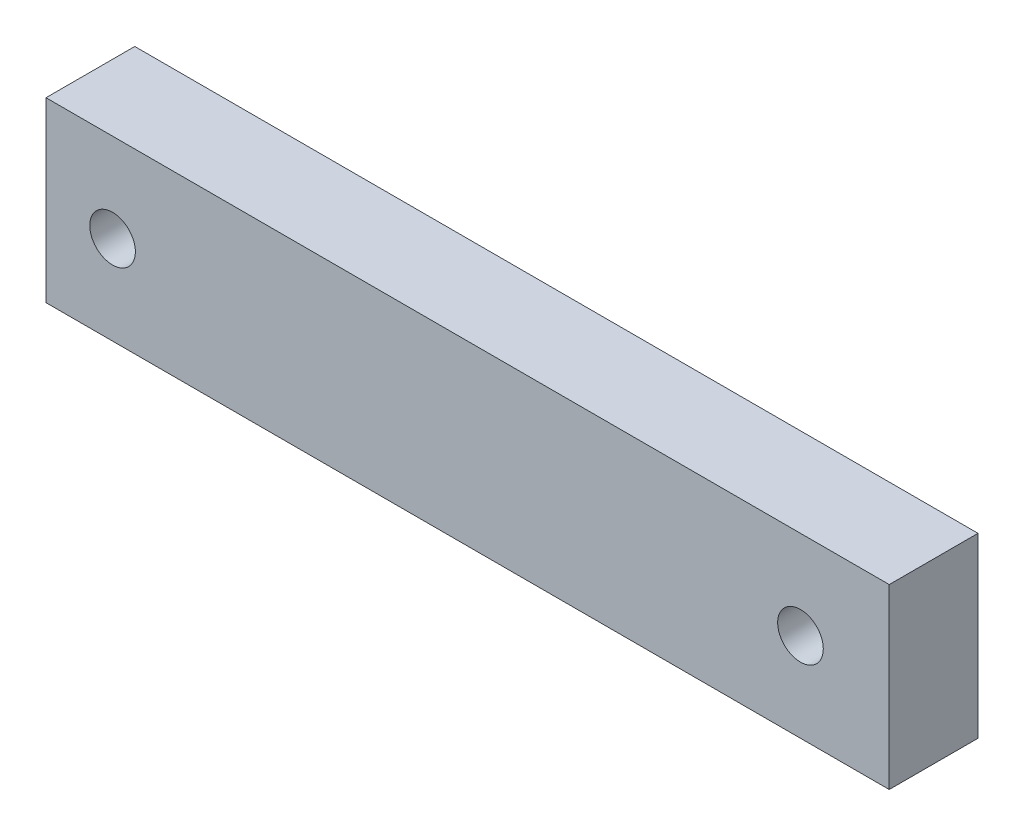
ISO-10303-21;
HEADER;
FILE_DESCRIPTION(('STEP AP214'),'2;1');
FILE_NAME('part.step','',(''),(''),'','','');
FILE_SCHEMA(('AUTOMOTIVE_DESIGN { 1 0 10303 214 1 1 1 1 }'));
ENDSEC;
DATA;
#1=APPLICATION_CONTEXT('core data for automotive mechanical design processes');
#2=APPLICATION_PROTOCOL_DEFINITION('international standard','automotive_design',2000,#1);
#3=PRODUCT_CONTEXT('',#1,'mechanical');
#4=PRODUCT('Part','Part','',(#3));
#5=PRODUCT_RELATED_PRODUCT_CATEGORY('part','',(#4));
#6=PRODUCT_DEFINITION_FORMATION('','',#4);
#7=PRODUCT_DEFINITION_CONTEXT('part definition',#1,'design');
#8=PRODUCT_DEFINITION('design','',#6,#7);
#9=PRODUCT_DEFINITION_SHAPE('','',#8);
#10=(LENGTH_UNIT() NAMED_UNIT(*) SI_UNIT(.MILLI.,.METRE.));
#11=(NAMED_UNIT(*) PLANE_ANGLE_UNIT() SI_UNIT($,.RADIAN.));
#12=(NAMED_UNIT(*) SI_UNIT($,.STERADIAN.) SOLID_ANGLE_UNIT());
#13=UNCERTAINTY_MEASURE_WITH_UNIT(LENGTH_MEASURE(1.E-05),#10,'distance_accuracy_value','');
#14=(GEOMETRIC_REPRESENTATION_CONTEXT(3) GLOBAL_UNCERTAINTY_ASSIGNED_CONTEXT((#13)) GLOBAL_UNIT_ASSIGNED_CONTEXT((#10,
#11,#12)) REPRESENTATION_CONTEXT('',''));
#15=CARTESIAN_POINT('',(0.,0.,0.));
#16=DIRECTION('',(0.,0.,1.));
#17=DIRECTION('',(1.,0.,0.));
#18=AXIS2_PLACEMENT_3D('',#15,#16,#17);
#19=CARTESIAN_POINT('',(30.1625,-6.35,6.35));
#20=DIRECTION('',(-1.,0.,0.));
#21=DIRECTION('',(0.,0.,1.));
#22=AXIS2_PLACEMENT_3D('',#19,#20,#21);
#23=PLANE('',#22);
#24=DIRECTION('',(0.,1.,0.));
#25=VECTOR('',#24,1.);
#26=CARTESIAN_POINT('',(30.1625,-6.35,0.));
#27=LINE('',#26,#25);
#28=CARTESIAN_POINT('',(30.1625,-6.35,0.));
#29=VERTEX_POINT('',#28);
#30=CARTESIAN_POINT('',(30.1625,6.35,0.));
#31=VERTEX_POINT('',#30);
#32=EDGE_CURVE('E97',#29,#31,#27,.T.);
#33=ORIENTED_EDGE('',*,*,#32,.T.);
#34=DIRECTION('',(0.,0.,-1.));
#35=VECTOR('',#34,1.);
#36=CARTESIAN_POINT('',(30.1625,6.35,6.35));
#37=LINE('',#36,#35);
#38=CARTESIAN_POINT('',(30.1625,6.35,6.35));
#39=VERTEX_POINT('',#38);
#40=EDGE_CURVE('E11',#39,#31,#37,.T.);
#41=ORIENTED_EDGE('',*,*,#40,.F.);
#42=DIRECTION('',(0.,1.,0.));
#43=VECTOR('',#42,1.);
#44=CARTESIAN_POINT('',(30.1625,-6.35,6.35));
#45=LINE('',#44,#43);
#46=CARTESIAN_POINT('',(30.1625,-6.35,6.35));
#47=VERTEX_POINT('',#46);
#48=EDGE_CURVE('E84',#47,#39,#45,.T.);
#49=ORIENTED_EDGE('',*,*,#48,.F.);
#50=DIRECTION('',(0.,0.,-1.));
#51=VECTOR('',#50,1.);
#52=CARTESIAN_POINT('',(30.1625,-6.35,6.35));
#53=LINE('',#52,#51);
#54=EDGE_CURVE('E93',#47,#29,#53,.T.);
#55=ORIENTED_EDGE('',*,*,#54,.T.);
#56=EDGE_LOOP('',(#33,#41,#49,#55));
#57=FACE_BOUND('',#56,.T.);
#58=ADVANCED_FACE('F32',(#57),#23,.F.);
#59=CARTESIAN_POINT('',(-30.1625,6.35,6.35));
#60=DIRECTION('',(0.,-1.,0.));
#61=DIRECTION('',(0.,0.,-1.));
#62=AXIS2_PLACEMENT_3D('',#59,#60,#61);
#63=PLANE('',#62);
#64=DIRECTION('',(-1.,0.,0.));
#65=VECTOR('',#64,1.);
#66=CARTESIAN_POINT('',(-30.1625,6.35,0.));
#67=LINE('',#66,#65);
#68=CARTESIAN_POINT('',(-30.1625,6.35,0.));
#69=VERTEX_POINT('',#68);
#70=EDGE_CURVE('E88',#31,#69,#67,.T.);
#71=ORIENTED_EDGE('',*,*,#70,.T.);
#72=DIRECTION('',(0.,0.,-1.));
#73=VECTOR('',#72,1.);
#74=CARTESIAN_POINT('',(-30.1625,6.35,6.35));
#75=LINE('',#74,#73);
#76=CARTESIAN_POINT('',(-30.1625,6.35,6.35));
#77=VERTEX_POINT('',#76);
#78=EDGE_CURVE('E41',#77,#69,#75,.T.);
#79=ORIENTED_EDGE('',*,*,#78,.F.);
#80=DIRECTION('',(-1.,0.,0.));
#81=VECTOR('',#80,1.);
#82=CARTESIAN_POINT('',(-30.1625,6.35,6.35));
#83=LINE('',#82,#81);
#84=EDGE_CURVE('E79',#39,#77,#83,.T.);
#85=ORIENTED_EDGE('',*,*,#84,.F.);
#86=ORIENTED_EDGE('',*,*,#40,.T.);
#87=EDGE_LOOP('',(#71,#79,#85,#86));
#88=FACE_BOUND('',#87,.T.);
#89=ADVANCED_FACE('F87',(#88),#63,.F.);
#90=CARTESIAN_POINT('',(-30.1625,-6.35,6.35));
#91=DIRECTION('',(1.,0.,0.));
#92=DIRECTION('',(0.,0.,-1.));
#93=AXIS2_PLACEMENT_3D('',#90,#91,#92);
#94=PLANE('',#93);
#95=DIRECTION('',(0.,-1.,0.));
#96=VECTOR('',#95,1.);
#97=CARTESIAN_POINT('',(-30.1625,-6.35,0.));
#98=LINE('',#97,#96);
#99=CARTESIAN_POINT('',(-30.1625,-6.35,0.));
#100=VERTEX_POINT('',#99);
#101=EDGE_CURVE('E66',#69,#100,#98,.T.);
#102=ORIENTED_EDGE('',*,*,#101,.T.);
#103=DIRECTION('',(0.,0.,-1.));
#104=VECTOR('',#103,1.);
#105=CARTESIAN_POINT('',(-30.1625,-6.35,6.35));
#106=LINE('',#105,#104);
#107=CARTESIAN_POINT('',(-30.1625,-6.35,6.35));
#108=VERTEX_POINT('',#107);
#109=EDGE_CURVE('E89',#108,#100,#106,.T.);
#110=ORIENTED_EDGE('',*,*,#109,.F.);
#111=DIRECTION('',(0.,-1.,0.));
#112=VECTOR('',#111,1.);
#113=CARTESIAN_POINT('',(-30.1625,-6.35,6.35));
#114=LINE('',#113,#112);
#115=EDGE_CURVE('E82',#77,#108,#114,.T.);
#116=ORIENTED_EDGE('',*,*,#115,.F.);
#117=ORIENTED_EDGE('',*,*,#78,.T.);
#118=EDGE_LOOP('',(#102,#110,#116,#117));
#119=FACE_BOUND('',#118,.T.);
#120=ADVANCED_FACE('F91',(#119),#94,.F.);
#121=CARTESIAN_POINT('',(-30.1625,-6.35,6.35));
#122=DIRECTION('',(0.,1.,0.));
#123=DIRECTION('',(0.,0.,1.));
#124=AXIS2_PLACEMENT_3D('',#121,#122,#123);
#125=PLANE('',#124);
#126=DIRECTION('',(1.,0.,0.));
#127=VECTOR('',#126,1.);
#128=CARTESIAN_POINT('',(-30.1625,-6.35,0.));
#129=LINE('',#128,#127);
#130=EDGE_CURVE('E72',#100,#29,#129,.T.);
#131=ORIENTED_EDGE('',*,*,#130,.T.);
#132=ORIENTED_EDGE('',*,*,#54,.F.);
#133=DIRECTION('',(1.,0.,0.));
#134=VECTOR('',#133,1.);
#135=CARTESIAN_POINT('',(-30.1625,-6.35,6.35));
#136=LINE('',#135,#134);
#137=EDGE_CURVE('E49',#108,#47,#136,.T.);
#138=ORIENTED_EDGE('',*,*,#137,.F.);
#139=ORIENTED_EDGE('',*,*,#109,.T.);
#140=EDGE_LOOP('',(#131,#132,#138,#139));
#141=FACE_BOUND('',#140,.T.);
#142=ADVANCED_FACE('F105',(#141),#125,.F.);
#143=CARTESIAN_POINT('',(30.1625,6.35,6.35));
#144=DIRECTION('',(0.,0.,-1.));
#145=DIRECTION('',(-1.,0.,0.));
#146=AXIS2_PLACEMENT_3D('',#143,#144,#145);
#147=PLANE('',#146);
#148=CARTESIAN_POINT('',(-25.4,0.,6.35));
#149=DIRECTION('',(0.,0.,1.));
#150=DIRECTION('',(1.,0.,0.));
#151=AXIS2_PLACEMENT_3D('',#148,#149,#150);
#152=CIRCLE('',#151,1.63194999999999);
#153=CARTESIAN_POINT('',(-23.76805,0.,6.35));
#154=VERTEX_POINT('',#153);
#155=EDGE_CURVE('E116',#154,#154,#152,.T.);
#156=ORIENTED_EDGE('',*,*,#155,.F.);
#157=EDGE_LOOP('',(#156));
#158=FACE_BOUND('',#157,.T.);
#159=CARTESIAN_POINT('',(23.8125,0.,6.35));
#160=DIRECTION('',(0.,0.,1.));
#161=DIRECTION('',(1.,0.,0.));
#162=AXIS2_PLACEMENT_3D('',#159,#160,#161);
#163=CIRCLE('',#162,1.63194999999999);
#164=CARTESIAN_POINT('',(25.44445,0.,6.35));
#165=VERTEX_POINT('',#164);
#166=EDGE_CURVE('E113',#165,#165,#163,.T.);
#167=ORIENTED_EDGE('',*,*,#166,.F.);
#168=EDGE_LOOP('',(#167));
#169=FACE_BOUND('',#168,.T.);
#170=ORIENTED_EDGE('',*,*,#48,.T.);
#171=ORIENTED_EDGE('',*,*,#84,.T.);
#172=ORIENTED_EDGE('',*,*,#115,.T.);
#173=ORIENTED_EDGE('',*,*,#137,.T.);
#174=EDGE_LOOP('',(#170,#171,#172,#173));
#175=FACE_BOUND('',#174,.T.);
#176=ADVANCED_FACE('F80',(#158,#169,#175),#147,.F.);
#177=CARTESIAN_POINT('',(30.1625,6.35,0.));
#178=DIRECTION('',(0.,0.,-1.));
#179=DIRECTION('',(-1.,0.,0.));
#180=AXIS2_PLACEMENT_3D('',#177,#178,#179);
#181=PLANE('',#180);
#182=CARTESIAN_POINT('',(-25.4,0.,0.));
#183=DIRECTION('',(0.,0.,-1.));
#184=DIRECTION('',(-1.,0.,0.));
#185=AXIS2_PLACEMENT_3D('',#182,#183,#184);
#186=CIRCLE('',#185,1.63194999999999);
#187=CARTESIAN_POINT('',(-27.03195,0.,0.));
#188=VERTEX_POINT('',#187);
#189=EDGE_CURVE('E35',#188,#188,#186,.T.);
#190=ORIENTED_EDGE('',*,*,#189,.F.);
#191=EDGE_LOOP('',(#190));
#192=FACE_BOUND('',#191,.T.);
#193=CARTESIAN_POINT('',(23.8125,0.,0.));
#194=DIRECTION('',(0.,0.,-1.));
#195=DIRECTION('',(-1.,0.,0.));
#196=AXIS2_PLACEMENT_3D('',#193,#194,#195);
#197=CIRCLE('',#196,1.63194999999999);
#198=CARTESIAN_POINT('',(22.18055,0.,0.));
#199=VERTEX_POINT('',#198);
#200=EDGE_CURVE('E100',#199,#199,#197,.T.);
#201=ORIENTED_EDGE('',*,*,#200,.F.);
#202=EDGE_LOOP('',(#201));
#203=FACE_BOUND('',#202,.T.);
#204=ORIENTED_EDGE('',*,*,#32,.F.);
#205=ORIENTED_EDGE('',*,*,#130,.F.);
#206=ORIENTED_EDGE('',*,*,#101,.F.);
#207=ORIENTED_EDGE('',*,*,#70,.F.);
#208=EDGE_LOOP('',(#204,#205,#206,#207));
#209=FACE_BOUND('',#208,.T.);
#210=ADVANCED_FACE('F108',(#192,#203,#209),#181,.T.);
#211=CARTESIAN_POINT('',(23.8125,0.,6.35));
#212=DIRECTION('',(0.,0.,1.));
#213=DIRECTION('',(1.,0.,0.));
#214=AXIS2_PLACEMENT_3D('',#211,#212,#213);
#215=CYLINDRICAL_SURFACE('',#214,1.63194999999999);
#216=ORIENTED_EDGE('',*,*,#200,.T.);
#217=EDGE_LOOP('',(#216));
#218=FACE_BOUND('',#217,.T.);
#219=ORIENTED_EDGE('',*,*,#166,.T.);
#220=EDGE_LOOP('',(#219));
#221=FACE_BOUND('',#220,.T.);
#222=ADVANCED_FACE('F127',(#218,#221),#215,.F.);
#223=CARTESIAN_POINT('',(-25.4,0.,6.35));
#224=DIRECTION('',(0.,0.,1.));
#225=DIRECTION('',(1.,0.,0.));
#226=AXIS2_PLACEMENT_3D('',#223,#224,#225);
#227=CYLINDRICAL_SURFACE('',#226,1.63194999999999);
#228=ORIENTED_EDGE('',*,*,#189,.T.);
#229=EDGE_LOOP('',(#228));
#230=FACE_BOUND('',#229,.T.);
#231=ORIENTED_EDGE('',*,*,#155,.T.);
#232=EDGE_LOOP('',(#231));
#233=FACE_BOUND('',#232,.T.);
#234=ADVANCED_FACE('F123',(#230,#233),#227,.F.);
#235=CLOSED_SHELL('',(#58,#89,#120,#142,#176,#210,#222,#234));
#236=MANIFOLD_SOLID_BREP('B2',#235);
#237=ADVANCED_BREP_SHAPE_REPRESENTATION('',(#18,#236),#14);
#238=SHAPE_DEFINITION_REPRESENTATION(#9,#237);
ENDSEC;
END-ISO-10303-21;
